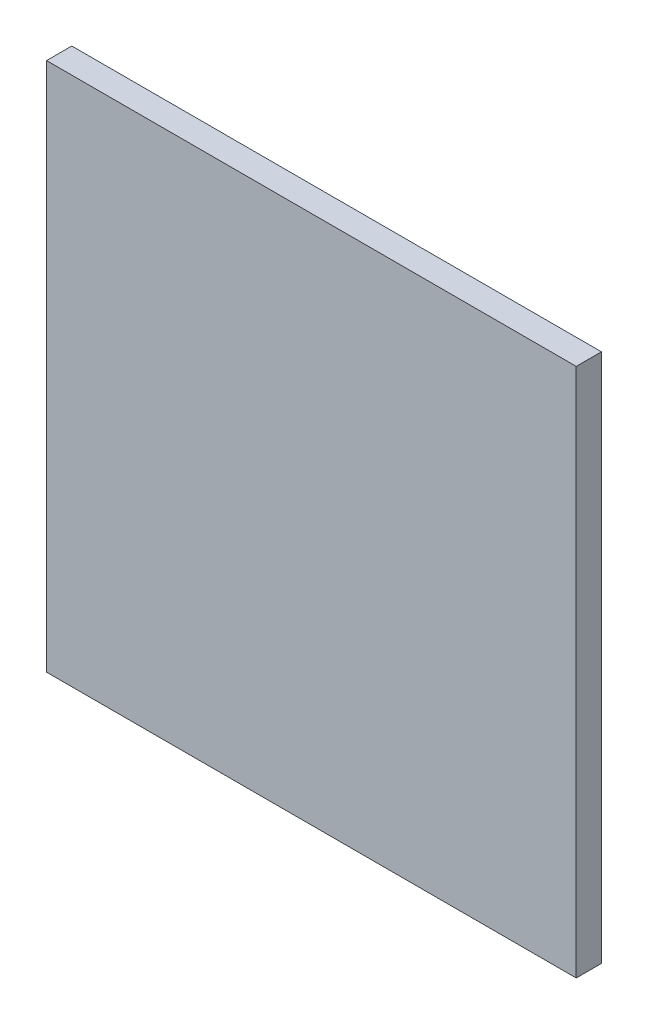
ISO-10303-21;
HEADER;
FILE_DESCRIPTION(('STEP AP214'),'2;1');
FILE_NAME('part.step','',(''),(''),'','','');
FILE_SCHEMA(('AUTOMOTIVE_DESIGN { 1 0 10303 214 1 1 1 1 }'));
ENDSEC;
DATA;
#1=APPLICATION_CONTEXT('core data for automotive mechanical design processes');
#2=APPLICATION_PROTOCOL_DEFINITION('international standard','automotive_design',2000,#1);
#3=PRODUCT_CONTEXT('',#1,'mechanical');
#4=PRODUCT('Part','Part','',(#3));
#5=PRODUCT_RELATED_PRODUCT_CATEGORY('part','',(#4));
#6=PRODUCT_DEFINITION_FORMATION('','',#4);
#7=PRODUCT_DEFINITION_CONTEXT('part definition',#1,'design');
#8=PRODUCT_DEFINITION('design','',#6,#7);
#9=PRODUCT_DEFINITION_SHAPE('','',#8);
#10=(LENGTH_UNIT() NAMED_UNIT(*) SI_UNIT(.MILLI.,.METRE.));
#11=(NAMED_UNIT(*) PLANE_ANGLE_UNIT() SI_UNIT($,.RADIAN.));
#12=(NAMED_UNIT(*) SI_UNIT($,.STERADIAN.) SOLID_ANGLE_UNIT());
#13=UNCERTAINTY_MEASURE_WITH_UNIT(LENGTH_MEASURE(1.E-05),#10,'distance_accuracy_value','');
#14=(GEOMETRIC_REPRESENTATION_CONTEXT(3) GLOBAL_UNCERTAINTY_ASSIGNED_CONTEXT((#13)) GLOBAL_UNIT_ASSIGNED_CONTEXT((#10,
#11,#12)) REPRESENTATION_CONTEXT('',''));
#15=CARTESIAN_POINT('',(0.,0.,0.));
#16=DIRECTION('',(0.,0.,1.));
#17=DIRECTION('',(1.,0.,0.));
#18=AXIS2_PLACEMENT_3D('',#15,#16,#17);
#19=CARTESIAN_POINT('',(-52.5,105.,5.));
#20=DIRECTION('',(1.,0.,0.));
#21=DIRECTION('',(0.,0.,-1.));
#22=AXIS2_PLACEMENT_3D('',#19,#20,#21);
#23=PLANE('',#22);
#24=DIRECTION('',(0.,-1.,0.));
#25=VECTOR('',#24,1.);
#26=CARTESIAN_POINT('',(-52.5,105.,0.));
#27=LINE('',#26,#25);
#28=CARTESIAN_POINT('',(-52.5,105.,0.));
#29=VERTEX_POINT('',#28);
#30=CARTESIAN_POINT('',(-52.5,0.,0.));
#31=VERTEX_POINT('',#30);
#32=EDGE_CURVE('E107',#29,#31,#27,.T.);
#33=ORIENTED_EDGE('',*,*,#32,.T.);
#34=DIRECTION('',(0.,0.,-1.));
#35=VECTOR('',#34,1.);
#36=CARTESIAN_POINT('',(-52.5,0.,5.));
#37=LINE('',#36,#35);
#38=CARTESIAN_POINT('',(-52.5,0.,5.));
#39=VERTEX_POINT('',#38);
#40=EDGE_CURVE('E11',#39,#31,#37,.T.);
#41=ORIENTED_EDGE('',*,*,#40,.F.);
#42=DIRECTION('',(0.,-1.,0.));
#43=VECTOR('',#42,1.);
#44=CARTESIAN_POINT('',(-52.5,105.,5.));
#45=LINE('',#44,#43);
#46=CARTESIAN_POINT('',(-52.5,105.,5.));
#47=VERTEX_POINT('',#46);
#48=EDGE_CURVE('E91',#47,#39,#45,.T.);
#49=ORIENTED_EDGE('',*,*,#48,.F.);
#50=DIRECTION('',(0.,0.,-1.));
#51=VECTOR('',#50,1.);
#52=CARTESIAN_POINT('',(-52.5,105.,5.));
#53=LINE('',#52,#51);
#54=EDGE_CURVE('E103',#47,#29,#53,.T.);
#55=ORIENTED_EDGE('',*,*,#54,.T.);
#56=EDGE_LOOP('',(#33,#41,#49,#55));
#57=FACE_BOUND('',#56,.T.);
#58=ADVANCED_FACE('F39',(#57),#23,.F.);
#59=CARTESIAN_POINT('',(-52.5,0.,5.));
#60=DIRECTION('',(0.,1.,0.));
#61=DIRECTION('',(-1.,0.,0.));
#62=AXIS2_PLACEMENT_3D('',#59,#60,#61);
#63=PLANE('',#62);
#64=DIRECTION('',(1.,0.,0.));
#65=VECTOR('',#64,1.);
#66=CARTESIAN_POINT('',(-52.5,0.,0.));
#67=LINE('',#66,#65);
#68=CARTESIAN_POINT('',(52.5,0.,0.));
#69=VERTEX_POINT('',#68);
#70=EDGE_CURVE('E96',#31,#69,#67,.T.);
#71=ORIENTED_EDGE('',*,*,#70,.T.);
#72=DIRECTION('',(0.,0.,-1.));
#73=VECTOR('',#72,1.);
#74=CARTESIAN_POINT('',(52.5,0.,5.));
#75=LINE('',#74,#73);
#76=CARTESIAN_POINT('',(52.5,0.,5.));
#77=VERTEX_POINT('',#76);
#78=EDGE_CURVE('E48',#77,#69,#75,.T.);
#79=ORIENTED_EDGE('',*,*,#78,.F.);
#80=DIRECTION('',(1.,0.,0.));
#81=VECTOR('',#80,1.);
#82=CARTESIAN_POINT('',(-52.5,0.,5.));
#83=LINE('',#82,#81);
#84=EDGE_CURVE('E86',#39,#77,#83,.T.);
#85=ORIENTED_EDGE('',*,*,#84,.F.);
#86=ORIENTED_EDGE('',*,*,#40,.T.);
#87=EDGE_LOOP('',(#71,#79,#85,#86));
#88=FACE_BOUND('',#87,.T.);
#89=ADVANCED_FACE('F95',(#88),#63,.F.);
#90=CARTESIAN_POINT('',(52.5,105.,5.));
#91=DIRECTION('',(-1.,0.,0.));
#92=DIRECTION('',(0.,0.,1.));
#93=AXIS2_PLACEMENT_3D('',#90,#91,#92);
#94=PLANE('',#93);
#95=DIRECTION('',(0.,1.,0.));
#96=VECTOR('',#95,1.);
#97=CARTESIAN_POINT('',(52.5,105.,0.));
#98=LINE('',#97,#96);
#99=CARTESIAN_POINT('',(52.5,105.,0.));
#100=VERTEX_POINT('',#99);
#101=EDGE_CURVE('E73',#69,#100,#98,.T.);
#102=ORIENTED_EDGE('',*,*,#101,.T.);
#103=DIRECTION('',(0.,0.,-1.));
#104=VECTOR('',#103,1.);
#105=CARTESIAN_POINT('',(52.5,105.,5.));
#106=LINE('',#105,#104);
#107=CARTESIAN_POINT('',(52.5,105.,5.));
#108=VERTEX_POINT('',#107);
#109=EDGE_CURVE('E98',#108,#100,#106,.T.);
#110=ORIENTED_EDGE('',*,*,#109,.F.);
#111=DIRECTION('',(0.,1.,0.));
#112=VECTOR('',#111,1.);
#113=CARTESIAN_POINT('',(52.5,105.,5.));
#114=LINE('',#113,#112);
#115=EDGE_CURVE('E89',#77,#108,#114,.T.);
#116=ORIENTED_EDGE('',*,*,#115,.F.);
#117=ORIENTED_EDGE('',*,*,#78,.T.);
#118=EDGE_LOOP('',(#102,#110,#116,#117));
#119=FACE_BOUND('',#118,.T.);
#120=ADVANCED_FACE('F99',(#119),#94,.F.);
#121=CARTESIAN_POINT('',(-52.5,105.,5.));
#122=DIRECTION('',(0.,-1.,0.));
#123=DIRECTION('',(0.,0.,-1.));
#124=AXIS2_PLACEMENT_3D('',#121,#122,#123);
#125=PLANE('',#124);
#126=DIRECTION('',(-1.,0.,0.));
#127=VECTOR('',#126,1.);
#128=CARTESIAN_POINT('',(-52.5,105.,0.));
#129=LINE('',#128,#127);
#130=EDGE_CURVE('E79',#100,#29,#129,.T.);
#131=ORIENTED_EDGE('',*,*,#130,.T.);
#132=ORIENTED_EDGE('',*,*,#54,.F.);
#133=DIRECTION('',(-1.,0.,0.));
#134=VECTOR('',#133,1.);
#135=CARTESIAN_POINT('',(-52.5,105.,5.));
#136=LINE('',#135,#134);
#137=EDGE_CURVE('E56',#108,#47,#136,.T.);
#138=ORIENTED_EDGE('',*,*,#137,.F.);
#139=ORIENTED_EDGE('',*,*,#109,.T.);
#140=EDGE_LOOP('',(#131,#132,#138,#139));
#141=FACE_BOUND('',#140,.T.);
#142=ADVANCED_FACE('F120',(#141),#125,.F.);
#143=CARTESIAN_POINT('',(0.,0.,5.));
#144=DIRECTION('',(0.,0.,1.));
#145=DIRECTION('',(1.,0.,0.));
#146=AXIS2_PLACEMENT_3D('',#143,#144,#145);
#147=PLANE('',#146);
#148=ORIENTED_EDGE('',*,*,#48,.T.);
#149=ORIENTED_EDGE('',*,*,#84,.T.);
#150=ORIENTED_EDGE('',*,*,#115,.T.);
#151=ORIENTED_EDGE('',*,*,#137,.T.);
#152=EDGE_LOOP('',(#148,#149,#150,#151));
#153=FACE_BOUND('',#152,.T.);
#154=ADVANCED_FACE('F87',(#153),#147,.T.);
#155=CARTESIAN_POINT('',(0.,0.,0.));
#156=DIRECTION('',(0.,0.,1.));
#157=DIRECTION('',(1.,0.,0.));
#158=AXIS2_PLACEMENT_3D('',#155,#156,#157);
#159=PLANE('',#158);
#160=ORIENTED_EDGE('',*,*,#32,.F.);
#161=ORIENTED_EDGE('',*,*,#130,.F.);
#162=ORIENTED_EDGE('',*,*,#101,.F.);
#163=ORIENTED_EDGE('',*,*,#70,.F.);
#164=EDGE_LOOP('',(#160,#161,#162,#163));
#165=FACE_BOUND('',#164,.T.);
#166=ADVANCED_FACE('F123',(#165),#159,.F.);
#167=CLOSED_SHELL('',(#58,#89,#120,#142,#154,#166));
#168=MANIFOLD_SOLID_BREP('B2',#167);
#169=ADVANCED_BREP_SHAPE_REPRESENTATION('',(#18,#168),#14);
#170=SHAPE_DEFINITION_REPRESENTATION(#9,#169);
ENDSEC;
END-ISO-10303-21;
